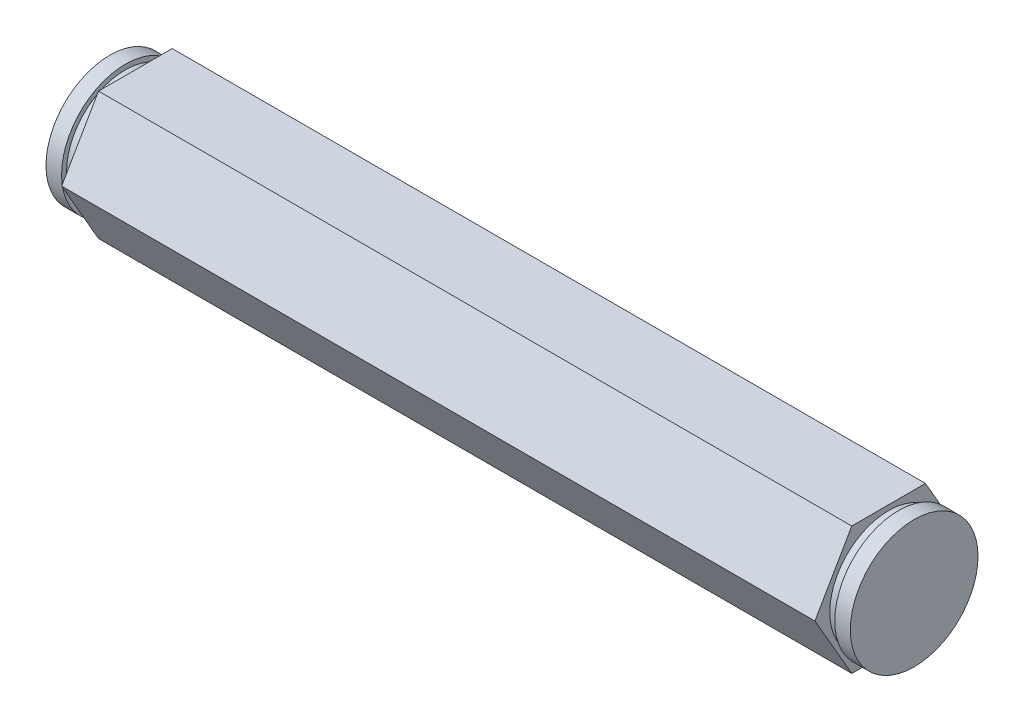
ISO-10303-21;
HEADER;
FILE_DESCRIPTION(('STEP AP214'),'2;1');
FILE_NAME('part.step','',(''),(''),'','','');
FILE_SCHEMA(('AUTOMOTIVE_DESIGN { 1 0 10303 214 1 1 1 1 }'));
ENDSEC;
DATA;
#1=APPLICATION_CONTEXT('core data for automotive mechanical design processes');
#2=APPLICATION_PROTOCOL_DEFINITION('international standard','automotive_design',2000,#1);
#3=PRODUCT_CONTEXT('',#1,'mechanical');
#4=PRODUCT('Part','Part','',(#3));
#5=PRODUCT_RELATED_PRODUCT_CATEGORY('part','',(#4));
#6=PRODUCT_DEFINITION_FORMATION('','',#4);
#7=PRODUCT_DEFINITION_CONTEXT('part definition',#1,'design');
#8=PRODUCT_DEFINITION('design','',#6,#7);
#9=PRODUCT_DEFINITION_SHAPE('','',#8);
#10=(LENGTH_UNIT() NAMED_UNIT(*) SI_UNIT(.MILLI.,.METRE.));
#11=(NAMED_UNIT(*) PLANE_ANGLE_UNIT() SI_UNIT($,.RADIAN.));
#12=(NAMED_UNIT(*) SI_UNIT($,.STERADIAN.) SOLID_ANGLE_UNIT());
#13=UNCERTAINTY_MEASURE_WITH_UNIT(LENGTH_MEASURE(1.E-05),#10,'distance_accuracy_value','');
#14=(GEOMETRIC_REPRESENTATION_CONTEXT(3) GLOBAL_UNCERTAINTY_ASSIGNED_CONTEXT((#13)) GLOBAL_UNIT_ASSIGNED_CONTEXT((#10,
#11,#12)) REPRESENTATION_CONTEXT('',''));
#15=CARTESIAN_POINT('',(0.,0.,0.));
#16=DIRECTION('',(0.,0.,1.));
#17=DIRECTION('',(1.,0.,0.));
#18=AXIS2_PLACEMENT_3D('',#15,#16,#17);
#19=CARTESIAN_POINT('',(40.005,-6.34999999999993,-3.66617420935418));
#20=DIRECTION('',(0.,0.499999999999995,0.866025403784441));
#21=DIRECTION('',(0.,-0.866025403784441,0.499999999999995));
#22=AXIS2_PLACEMENT_3D('',#19,#20,#21);
#23=PLANE('',#22);
#24=DIRECTION('',(-1.,0.,0.));
#25=VECTOR('',#24,1.);
#26=CARTESIAN_POINT('',(40.005,-6.34999999999993,-3.66617420935418));
#27=LINE('',#26,#25);
#28=CARTESIAN_POINT('',(37.465,-6.34999999999993,-3.66617420935418));
#29=VERTEX_POINT('',#28);
#30=CARTESIAN_POINT('',(-37.465,-6.34999999999993,-3.66617420935418));
#31=VERTEX_POINT('',#30);
#32=EDGE_CURVE('E105',#29,#31,#27,.T.);
#33=ORIENTED_EDGE('',*,*,#32,.T.);
#34=DIRECTION('',(0.,0.866025403784441,-0.499999999999995));
#35=VECTOR('',#34,1.);
#36=CARTESIAN_POINT('',(-37.465,-6.34999999999993,-3.66617420935418));
#37=LINE('',#36,#35);
#38=CARTESIAN_POINT('',(-37.465,0.,-7.33234841870821));
#39=VERTEX_POINT('',#38);
#40=EDGE_CURVE('E51',#31,#39,#37,.T.);
#41=ORIENTED_EDGE('',*,*,#40,.T.);
#42=DIRECTION('',(-1.,0.,0.));
#43=VECTOR('',#42,1.);
#44=CARTESIAN_POINT('',(40.005,0.,-7.33234841870821));
#45=LINE('',#44,#43);
#46=CARTESIAN_POINT('',(37.465,0.,-7.33234841870821));
#47=VERTEX_POINT('',#46);
#48=EDGE_CURVE('E118',#47,#39,#45,.T.);
#49=ORIENTED_EDGE('',*,*,#48,.F.);
#50=DIRECTION('',(0.,-0.866025403784441,0.499999999999995));
#51=VECTOR('',#50,1.);
#52=CARTESIAN_POINT('',(37.465,-6.34999999999993,-3.66617420935418));
#53=LINE('',#52,#51);
#54=EDGE_CURVE('E109',#47,#29,#53,.T.);
#55=ORIENTED_EDGE('',*,*,#54,.T.);
#56=EDGE_LOOP('',(#33,#41,#49,#55));
#57=FACE_BOUND('',#56,.T.);
#58=ADVANCED_FACE('F37',(#57),#23,.F.);
#59=CARTESIAN_POINT('',(40.005,0.,-7.33234841870821));
#60=DIRECTION('',(0.,-0.500000000000001,0.866025403784438));
#61=DIRECTION('',(0.,-0.866025403784438,-0.500000000000001));
#62=AXIS2_PLACEMENT_3D('',#59,#60,#61);
#63=PLANE('',#62);
#64=ORIENTED_EDGE('',*,*,#48,.T.);
#65=DIRECTION('',(0.,0.866025403784438,0.500000000000001));
#66=VECTOR('',#65,1.);
#67=CARTESIAN_POINT('',(-37.465,0.,-7.33234841870821));
#68=LINE('',#67,#66);
#69=CARTESIAN_POINT('',(-37.465,6.34999999999998,-3.66617420935409));
#70=VERTEX_POINT('',#69);
#71=EDGE_CURVE('E149',#39,#70,#68,.T.);
#72=ORIENTED_EDGE('',*,*,#71,.T.);
#73=DIRECTION('',(-1.,0.,0.));
#74=VECTOR('',#73,1.);
#75=CARTESIAN_POINT('',(40.005,6.34999999999998,-3.66617420935409));
#76=LINE('',#75,#74);
#77=CARTESIAN_POINT('',(37.465,6.34999999999998,-3.66617420935409));
#78=VERTEX_POINT('',#77);
#79=EDGE_CURVE('E115',#78,#70,#76,.T.);
#80=ORIENTED_EDGE('',*,*,#79,.F.);
#81=DIRECTION('',(0.,-0.866025403784438,-0.500000000000001));
#82=VECTOR('',#81,1.);
#83=CARTESIAN_POINT('',(37.465,0.,-7.33234841870821));
#84=LINE('',#83,#82);
#85=EDGE_CURVE('E169',#78,#47,#84,.T.);
#86=ORIENTED_EDGE('',*,*,#85,.T.);
#87=EDGE_LOOP('',(#64,#72,#80,#86));
#88=FACE_BOUND('',#87,.T.);
#89=ADVANCED_FACE('F177',(#88),#63,.F.);
#90=CARTESIAN_POINT('',(40.005,6.34999999999998,-3.66617420935409));
#91=DIRECTION('',(0.,-1.,0.));
#92=DIRECTION('',(0.,0.,-1.));
#93=AXIS2_PLACEMENT_3D('',#90,#91,#92);
#94=PLANE('',#93);
#95=ORIENTED_EDGE('',*,*,#79,.T.);
#96=DIRECTION('',(0.,0.,1.));
#97=VECTOR('',#96,1.);
#98=CARTESIAN_POINT('',(-37.465,6.34999999999998,-3.66617420935409));
#99=LINE('',#98,#97);
#100=CARTESIAN_POINT('',(-37.465,6.34999999999995,3.66617420935414));
#101=VERTEX_POINT('',#100);
#102=EDGE_CURVE('E146',#70,#101,#99,.T.);
#103=ORIENTED_EDGE('',*,*,#102,.T.);
#104=DIRECTION('',(-1.,0.,0.));
#105=VECTOR('',#104,1.);
#106=CARTESIAN_POINT('',(40.005,6.34999999999995,3.66617420935414));
#107=LINE('',#106,#105);
#108=CARTESIAN_POINT('',(37.465,6.34999999999995,3.66617420935414));
#109=VERTEX_POINT('',#108);
#110=EDGE_CURVE('E107',#109,#101,#107,.T.);
#111=ORIENTED_EDGE('',*,*,#110,.F.);
#112=DIRECTION('',(0.,0.,-1.));
#113=VECTOR('',#112,1.);
#114=CARTESIAN_POINT('',(37.465,6.34999999999998,-3.66617420935409));
#115=LINE('',#114,#113);
#116=EDGE_CURVE('E166',#109,#78,#115,.T.);
#117=ORIENTED_EDGE('',*,*,#116,.T.);
#118=EDGE_LOOP('',(#95,#103,#111,#117));
#119=FACE_BOUND('',#118,.T.);
#120=ADVANCED_FACE('F179',(#119),#94,.F.);
#121=CARTESIAN_POINT('',(40.005,6.34999999999995,3.66617420935414));
#122=DIRECTION('',(0.,-0.499999999999995,-0.866025403784442));
#123=DIRECTION('',(0.,0.866025403784442,-0.499999999999995));
#124=AXIS2_PLACEMENT_3D('',#121,#122,#123);
#125=PLANE('',#124);
#126=ORIENTED_EDGE('',*,*,#110,.T.);
#127=DIRECTION('',(0.,-0.866025403784442,0.499999999999995));
#128=VECTOR('',#127,1.);
#129=CARTESIAN_POINT('',(-37.465,6.34999999999995,3.66617420935414));
#130=LINE('',#129,#128);
#131=CARTESIAN_POINT('',(-37.465,0.,7.33234841870821));
#132=VERTEX_POINT('',#131);
#133=EDGE_CURVE('E100',#101,#132,#130,.T.);
#134=ORIENTED_EDGE('',*,*,#133,.T.);
#135=DIRECTION('',(-1.,0.,0.));
#136=VECTOR('',#135,1.);
#137=CARTESIAN_POINT('',(40.005,0.,7.33234841870821));
#138=LINE('',#137,#136);
#139=CARTESIAN_POINT('',(37.465,0.,7.33234841870821));
#140=VERTEX_POINT('',#139);
#141=EDGE_CURVE('E99',#140,#132,#138,.T.);
#142=ORIENTED_EDGE('',*,*,#141,.F.);
#143=DIRECTION('',(0.,0.866025403784442,-0.499999999999995));
#144=VECTOR('',#143,1.);
#145=CARTESIAN_POINT('',(37.465,6.34999999999995,3.66617420935414));
#146=LINE('',#145,#144);
#147=EDGE_CURVE('E163',#140,#109,#146,.T.);
#148=ORIENTED_EDGE('',*,*,#147,.T.);
#149=EDGE_LOOP('',(#126,#134,#142,#148));
#150=FACE_BOUND('',#149,.T.);
#151=ADVANCED_FACE('F182',(#150),#125,.F.);
#152=CARTESIAN_POINT('',(40.005,0.,7.33234841870821));
#153=DIRECTION('',(0.,0.500000000000007,-0.866025403784435));
#154=DIRECTION('',(0.,0.866025403784435,0.500000000000007));
#155=AXIS2_PLACEMENT_3D('',#152,#153,#154);
#156=PLANE('',#155);
#157=ORIENTED_EDGE('',*,*,#141,.T.);
#158=DIRECTION('',(0.,-0.866025403784435,-0.500000000000007));
#159=VECTOR('',#158,1.);
#160=CARTESIAN_POINT('',(-37.465,0.,7.33234841870821));
#161=LINE('',#160,#159);
#162=CARTESIAN_POINT('',(-37.465,-6.35,3.66617420935405));
#163=VERTEX_POINT('',#162);
#164=EDGE_CURVE('E87',#132,#163,#161,.T.);
#165=ORIENTED_EDGE('',*,*,#164,.T.);
#166=DIRECTION('',(-1.,0.,0.));
#167=VECTOR('',#166,1.);
#168=CARTESIAN_POINT('',(40.005,-6.35,3.66617420935405));
#169=LINE('',#168,#167);
#170=CARTESIAN_POINT('',(37.465,-6.35,3.66617420935405));
#171=VERTEX_POINT('',#170);
#172=EDGE_CURVE('E97',#171,#163,#169,.T.);
#173=ORIENTED_EDGE('',*,*,#172,.F.);
#174=DIRECTION('',(0.,0.866025403784435,0.500000000000007));
#175=VECTOR('',#174,1.);
#176=CARTESIAN_POINT('',(37.465,0.,7.33234841870821));
#177=LINE('',#176,#175);
#178=EDGE_CURVE('E58',#171,#140,#177,.T.);
#179=ORIENTED_EDGE('',*,*,#178,.T.);
#180=EDGE_LOOP('',(#157,#165,#173,#179));
#181=FACE_BOUND('',#180,.T.);
#182=ADVANCED_FACE('F96',(#181),#156,.F.);
#183=CARTESIAN_POINT('',(40.005,-6.35,3.66617420935405));
#184=DIRECTION('',(0.,1.,0.));
#185=DIRECTION('',(0.,0.,1.));
#186=AXIS2_PLACEMENT_3D('',#183,#184,#185);
#187=PLANE('',#186);
#188=ORIENTED_EDGE('',*,*,#172,.T.);
#189=DIRECTION('',(0.,0.,-1.));
#190=VECTOR('',#189,1.);
#191=CARTESIAN_POINT('',(-37.465,-6.35,3.66617420935405));
#192=LINE('',#191,#190);
#193=EDGE_CURVE('E11',#163,#31,#192,.T.);
#194=ORIENTED_EDGE('',*,*,#193,.T.);
#195=ORIENTED_EDGE('',*,*,#32,.F.);
#196=DIRECTION('',(0.,0.,1.));
#197=VECTOR('',#196,1.);
#198=CARTESIAN_POINT('',(37.465,-6.35,3.66617420935405));
#199=LINE('',#198,#197);
#200=EDGE_CURVE('E104',#29,#171,#199,.T.);
#201=ORIENTED_EDGE('',*,*,#200,.T.);
#202=EDGE_LOOP('',(#188,#194,#195,#201));
#203=FACE_BOUND('',#202,.T.);
#204=ADVANCED_FACE('F103',(#203),#187,.F.);
#205=CARTESIAN_POINT('',(37.465,0.,8.89));
#206=DIRECTION('',(-1.,0.,0.));
#207=DIRECTION('',(0.,0.,1.));
#208=AXIS2_PLACEMENT_3D('',#205,#206,#207);
#209=PLANE('',#208);
#210=CARTESIAN_POINT('',(37.465,0.,0.));
#211=DIRECTION('',(-1.,0.,0.));
#212=DIRECTION('',(0.,0.,1.));
#213=AXIS2_PLACEMENT_3D('',#210,#211,#212);
#214=CIRCLE('',#213,5.8547);
#215=CARTESIAN_POINT('',(37.465,0.,5.8547));
#216=VERTEX_POINT('',#215);
#217=EDGE_CURVE('E159',#216,#216,#214,.T.);
#218=ORIENTED_EDGE('',*,*,#217,.T.);
#219=EDGE_LOOP('',(#218));
#220=FACE_BOUND('',#219,.T.);
#221=ORIENTED_EDGE('',*,*,#85,.F.);
#222=ORIENTED_EDGE('',*,*,#116,.F.);
#223=ORIENTED_EDGE('',*,*,#147,.F.);
#224=ORIENTED_EDGE('',*,*,#178,.F.);
#225=ORIENTED_EDGE('',*,*,#200,.F.);
#226=ORIENTED_EDGE('',*,*,#54,.F.);
#227=EDGE_LOOP('',(#221,#222,#223,#224,#225,#226));
#228=FACE_BOUND('',#227,.T.);
#229=ADVANCED_FACE('F174',(#220,#228),#209,.F.);
#230=CARTESIAN_POINT('',(0.,0.,0.));
#231=DIRECTION('',(-1.,0.,0.));
#232=DIRECTION('',(0.,0.,1.));
#233=AXIS2_PLACEMENT_3D('',#230,#231,#232);
#234=CYLINDRICAL_SURFACE('',#233,6.35);
#235=CARTESIAN_POINT('',(40.005,0.,0.));
#236=DIRECTION('',(1.,0.,0.));
#237=DIRECTION('',(0.,0.,-1.));
#238=AXIS2_PLACEMENT_3D('',#235,#236,#237);
#239=CIRCLE('',#238,6.35);
#240=CARTESIAN_POINT('',(40.005,0.,-6.35));
#241=VERTEX_POINT('',#240);
#242=EDGE_CURVE('E121',#241,#241,#239,.F.);
#243=ORIENTED_EDGE('',*,*,#242,.T.);
#244=EDGE_LOOP('',(#243));
#245=FACE_BOUND('',#244,.T.);
#246=CARTESIAN_POINT('',(38.4556,0.,0.));
#247=DIRECTION('',(-1.,0.,0.));
#248=DIRECTION('',(0.,0.,1.));
#249=AXIS2_PLACEMENT_3D('',#246,#247,#248);
#250=CIRCLE('',#249,6.35);
#251=CARTESIAN_POINT('',(38.4556,0.,6.35));
#252=VERTEX_POINT('',#251);
#253=EDGE_CURVE('E153',#252,#252,#250,.T.);
#254=ORIENTED_EDGE('',*,*,#253,.F.);
#255=EDGE_LOOP('',(#254));
#256=FACE_BOUND('',#255,.T.);
#257=ADVANCED_FACE('F299',(#245,#256),#234,.T.);
#258=CARTESIAN_POINT('',(0.,0.,0.));
#259=DIRECTION('',(-1.,0.,0.));
#260=DIRECTION('',(0.,0.,1.));
#261=AXIS2_PLACEMENT_3D('',#258,#259,#260);
#262=CYLINDRICAL_SURFACE('',#261,5.8547);
#263=ORIENTED_EDGE('',*,*,#217,.F.);
#264=EDGE_LOOP('',(#263));
#265=FACE_BOUND('',#264,.T.);
#266=CARTESIAN_POINT('',(38.4556,0.,0.));
#267=DIRECTION('',(-1.,0.,0.));
#268=DIRECTION('',(0.,0.,1.));
#269=AXIS2_PLACEMENT_3D('',#266,#267,#268);
#270=CIRCLE('',#269,5.8547);
#271=CARTESIAN_POINT('',(38.4556,0.,5.8547));
#272=VERTEX_POINT('',#271);
#273=EDGE_CURVE('E156',#272,#272,#270,.T.);
#274=ORIENTED_EDGE('',*,*,#273,.T.);
#275=EDGE_LOOP('',(#274));
#276=FACE_BOUND('',#275,.T.);
#277=ADVANCED_FACE('F287',(#265,#276),#262,.T.);
#278=CARTESIAN_POINT('',(38.4556,0.,5.8547));
#279=DIRECTION('',(1.,0.,0.));
#280=DIRECTION('',(0.,0.,-1.));
#281=AXIS2_PLACEMENT_3D('',#278,#279,#280);
#282=PLANE('',#281);
#283=ORIENTED_EDGE('',*,*,#273,.F.);
#284=EDGE_LOOP('',(#283));
#285=FACE_BOUND('',#284,.T.);
#286=ORIENTED_EDGE('',*,*,#253,.T.);
#287=EDGE_LOOP('',(#286));
#288=FACE_BOUND('',#287,.T.);
#289=ADVANCED_FACE('F281',(#285,#288),#282,.F.);
#290=CARTESIAN_POINT('',(40.005,0.,0.));
#291=DIRECTION('',(1.,0.,0.));
#292=DIRECTION('',(0.,0.,-1.));
#293=AXIS2_PLACEMENT_3D('',#290,#291,#292);
#294=PLANE('',#293);
#295=ORIENTED_EDGE('',*,*,#242,.F.);
#296=EDGE_LOOP('',(#295));
#297=FACE_BOUND('',#296,.T.);
#298=ADVANCED_FACE('F234',(#297),#294,.T.);
#299=CARTESIAN_POINT('',(-37.465,0.,8.89));
#300=DIRECTION('',(1.,0.,0.));
#301=DIRECTION('',(0.,0.,1.));
#302=AXIS2_PLACEMENT_3D('',#299,#300,#301);
#303=PLANE('',#302);
#304=CARTESIAN_POINT('',(-37.465,0.,0.));
#305=DIRECTION('',(-1.,0.,0.));
#306=DIRECTION('',(0.,0.,1.));
#307=AXIS2_PLACEMENT_3D('',#304,#305,#306);
#308=CIRCLE('',#307,5.8547);
#309=CARTESIAN_POINT('',(-37.465,0.,5.8547));
#310=VERTEX_POINT('',#309);
#311=EDGE_CURVE('E101',#310,#310,#308,.T.);
#312=ORIENTED_EDGE('',*,*,#311,.F.);
#313=EDGE_LOOP('',(#312));
#314=FACE_BOUND('',#313,.T.);
#315=ORIENTED_EDGE('',*,*,#193,.F.);
#316=ORIENTED_EDGE('',*,*,#164,.F.);
#317=ORIENTED_EDGE('',*,*,#133,.F.);
#318=ORIENTED_EDGE('',*,*,#102,.F.);
#319=ORIENTED_EDGE('',*,*,#71,.F.);
#320=ORIENTED_EDGE('',*,*,#40,.F.);
#321=EDGE_LOOP('',(#315,#316,#317,#318,#319,#320));
#322=FACE_BOUND('',#321,.T.);
#323=ADVANCED_FACE('F86',(#314,#322),#303,.F.);
#324=CARTESIAN_POINT('',(0.,0.,0.));
#325=DIRECTION('',(1.,0.,0.));
#326=DIRECTION('',(0.,0.,1.));
#327=AXIS2_PLACEMENT_3D('',#324,#325,#326);
#328=CYLINDRICAL_SURFACE('',#327,6.35);
#329=CARTESIAN_POINT('',(-40.005,0.,0.));
#330=DIRECTION('',(1.,0.,0.));
#331=DIRECTION('',(0.,0.,-1.));
#332=AXIS2_PLACEMENT_3D('',#329,#330,#331);
#333=CIRCLE('',#332,6.35);
#334=CARTESIAN_POINT('',(-40.005,0.,-6.35));
#335=VERTEX_POINT('',#334);
#336=EDGE_CURVE('E44',#335,#335,#333,.F.);
#337=ORIENTED_EDGE('',*,*,#336,.F.);
#338=EDGE_LOOP('',(#337));
#339=FACE_BOUND('',#338,.T.);
#340=CARTESIAN_POINT('',(-38.4556,0.,0.));
#341=DIRECTION('',(-1.,0.,0.));
#342=DIRECTION('',(0.,0.,1.));
#343=AXIS2_PLACEMENT_3D('',#340,#341,#342);
#344=CIRCLE('',#343,6.35);
#345=CARTESIAN_POINT('',(-38.4556,0.,6.35));
#346=VERTEX_POINT('',#345);
#347=EDGE_CURVE('E136',#346,#346,#344,.T.);
#348=ORIENTED_EDGE('',*,*,#347,.T.);
#349=EDGE_LOOP('',(#348));
#350=FACE_BOUND('',#349,.T.);
#351=ADVANCED_FACE('F129',(#339,#350),#328,.T.);
#352=CARTESIAN_POINT('',(0.,0.,0.));
#353=DIRECTION('',(1.,0.,0.));
#354=DIRECTION('',(0.,0.,1.));
#355=AXIS2_PLACEMENT_3D('',#352,#353,#354);
#356=CYLINDRICAL_SURFACE('',#355,5.8547);
#357=ORIENTED_EDGE('',*,*,#311,.T.);
#358=EDGE_LOOP('',(#357));
#359=FACE_BOUND('',#358,.T.);
#360=CARTESIAN_POINT('',(-38.4556,0.,0.));
#361=DIRECTION('',(-1.,0.,0.));
#362=DIRECTION('',(0.,0.,1.));
#363=AXIS2_PLACEMENT_3D('',#360,#361,#362);
#364=CIRCLE('',#363,5.8547);
#365=CARTESIAN_POINT('',(-38.4556,0.,5.8547));
#366=VERTEX_POINT('',#365);
#367=EDGE_CURVE('E138',#366,#366,#364,.T.);
#368=ORIENTED_EDGE('',*,*,#367,.F.);
#369=EDGE_LOOP('',(#368));
#370=FACE_BOUND('',#369,.T.);
#371=ADVANCED_FACE('F132',(#359,#370),#356,.T.);
#372=CARTESIAN_POINT('',(-38.4556,0.,5.8547));
#373=DIRECTION('',(-1.,0.,0.));
#374=DIRECTION('',(0.,0.,-1.));
#375=AXIS2_PLACEMENT_3D('',#372,#373,#374);
#376=PLANE('',#375);
#377=ORIENTED_EDGE('',*,*,#367,.T.);
#378=EDGE_LOOP('',(#377));
#379=FACE_BOUND('',#378,.T.);
#380=ORIENTED_EDGE('',*,*,#347,.F.);
#381=EDGE_LOOP('',(#380));
#382=FACE_BOUND('',#381,.T.);
#383=ADVANCED_FACE('F254',(#379,#382),#376,.F.);
#384=CARTESIAN_POINT('',(-40.005,0.,0.));
#385=DIRECTION('',(1.,0.,0.));
#386=DIRECTION('',(0.,0.,-1.));
#387=AXIS2_PLACEMENT_3D('',#384,#385,#386);
#388=PLANE('',#387);
#389=ORIENTED_EDGE('',*,*,#336,.T.);
#390=EDGE_LOOP('',(#389));
#391=FACE_BOUND('',#390,.T.);
#392=ADVANCED_FACE('F127',(#391),#388,.F.);
#393=CLOSED_SHELL('',(#58,#89,#120,#151,#182,#204,#229,#257,#277,#289,#298,#323,#351,#371,#383,#392));
#394=MANIFOLD_SOLID_BREP('B2',#393);
#395=ADVANCED_BREP_SHAPE_REPRESENTATION('',(#18,#394),#14);
#396=SHAPE_DEFINITION_REPRESENTATION(#9,#395);
ENDSEC;
END-ISO-10303-21;
